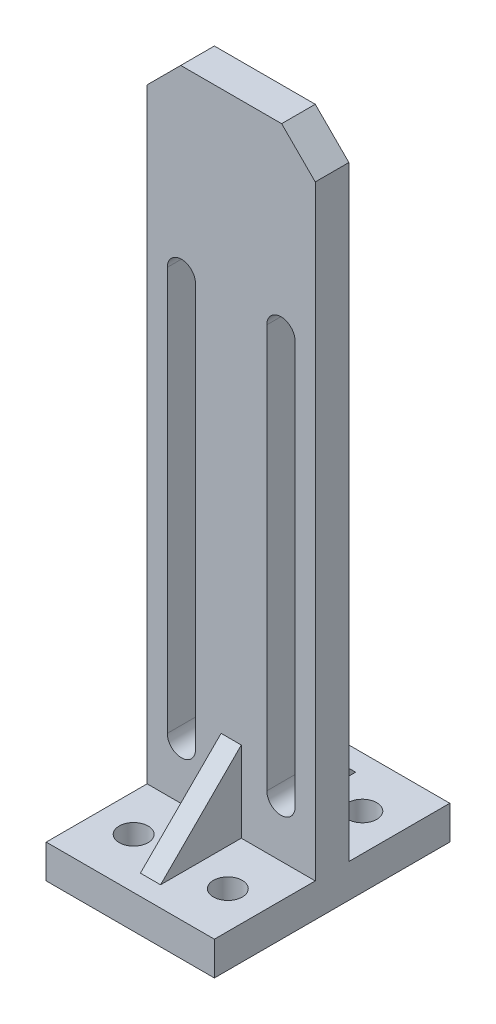
ISO-10303-21;
HEADER;
FILE_DESCRIPTION(('STEP AP214'),'2;1');
FILE_NAME('part.step','',(''),(''),'','','');
FILE_SCHEMA(('AUTOMOTIVE_DESIGN { 1 0 10303 214 1 1 1 1 }'));
ENDSEC;
DATA;
#1=APPLICATION_CONTEXT('core data for automotive mechanical design processes');
#2=APPLICATION_PROTOCOL_DEFINITION('international standard','automotive_design',2000,#1);
#3=PRODUCT_CONTEXT('',#1,'mechanical');
#4=PRODUCT('Part','Part','',(#3));
#5=PRODUCT_RELATED_PRODUCT_CATEGORY('part','',(#4));
#6=PRODUCT_DEFINITION_FORMATION('','',#4);
#7=PRODUCT_DEFINITION_CONTEXT('part definition',#1,'design');
#8=PRODUCT_DEFINITION('design','',#6,#7);
#9=PRODUCT_DEFINITION_SHAPE('','',#8);
#10=(LENGTH_UNIT() NAMED_UNIT(*) SI_UNIT(.MILLI.,.METRE.));
#11=(NAMED_UNIT(*) PLANE_ANGLE_UNIT() SI_UNIT($,.RADIAN.));
#12=(NAMED_UNIT(*) SI_UNIT($,.STERADIAN.) SOLID_ANGLE_UNIT());
#13=UNCERTAINTY_MEASURE_WITH_UNIT(LENGTH_MEASURE(1.E-05),#10,'distance_accuracy_value','');
#14=(GEOMETRIC_REPRESENTATION_CONTEXT(3) GLOBAL_UNCERTAINTY_ASSIGNED_CONTEXT((#13)) GLOBAL_UNIT_ASSIGNED_CONTEXT((#10,
#11,#12)) REPRESENTATION_CONTEXT('',''));
#15=CARTESIAN_POINT('',(0.,0.,0.));
#16=DIRECTION('',(0.,0.,1.));
#17=DIRECTION('',(1.,0.,0.));
#18=AXIS2_PLACEMENT_3D('',#15,#16,#17);
#19=CARTESIAN_POINT('',(0.,0.,2.5));
#20=DIRECTION('',(0.,0.,1.));
#21=DIRECTION('',(1.,0.,0.));
#22=AXIS2_PLACEMENT_3D('',#19,#20,#21);
#23=PLANE('',#22);
#24=DIRECTION('',(0.,1.,0.));
#25=VECTOR('',#24,1.);
#26=CARTESIAN_POINT('',(1.5,-33.,2.5));
#27=LINE('',#26,#25);
#28=CARTESIAN_POINT('',(1.5,-45.,2.5));
#29=VERTEX_POINT('',#28);
#30=CARTESIAN_POINT('',(1.5,-33.,2.5));
#31=VERTEX_POINT('',#30);
#32=EDGE_CURVE('E243',#29,#31,#27,.T.);
#33=ORIENTED_EDGE('',*,*,#32,.F.);
#34=DIRECTION('',(-1.,0.,0.));
#35=VECTOR('',#34,1.);
#36=CARTESIAN_POINT('',(12.5,-45.,2.5));
#37=LINE('',#36,#35);
#38=CARTESIAN_POINT('',(12.5,-45.,2.5));
#39=VERTEX_POINT('',#38);
#40=EDGE_CURVE('E308',#39,#29,#37,.T.);
#41=ORIENTED_EDGE('',*,*,#40,.F.);
#42=DIRECTION('',(0.,1.,0.));
#43=VECTOR('',#42,1.);
#44=CARTESIAN_POINT('',(12.5,45.,2.5));
#45=LINE('',#44,#43);
#46=CARTESIAN_POINT('',(12.5,45.,2.5));
#47=VERTEX_POINT('',#46);
#48=EDGE_CURVE('E399',#39,#47,#45,.T.);
#49=ORIENTED_EDGE('',*,*,#48,.T.);
#50=DIRECTION('',(-0.707106781186548,0.707106781186547,0.));
#51=VECTOR('',#50,1.);
#52=CARTESIAN_POINT('',(7.49999999999999,50.,2.5));
#53=LINE('',#52,#51);
#54=CARTESIAN_POINT('',(7.49999999999999,50.,2.5));
#55=VERTEX_POINT('',#54);
#56=EDGE_CURVE('E402',#47,#55,#53,.T.);
#57=ORIENTED_EDGE('',*,*,#56,.T.);
#58=DIRECTION('',(-1.,0.,0.));
#59=VECTOR('',#58,1.);
#60=CARTESIAN_POINT('',(-7.50000000000001,50.,2.5));
#61=LINE('',#60,#59);
#62=CARTESIAN_POINT('',(-7.50000000000001,50.,2.5));
#63=VERTEX_POINT('',#62);
#64=EDGE_CURVE('E406',#55,#63,#61,.T.);
#65=ORIENTED_EDGE('',*,*,#64,.T.);
#66=DIRECTION('',(-0.707106781186548,-0.707106781186547,0.));
#67=VECTOR('',#66,1.);
#68=CARTESIAN_POINT('',(-12.5,45.,2.5));
#69=LINE('',#68,#67);
#70=CARTESIAN_POINT('',(-12.5,45.,2.5));
#71=VERTEX_POINT('',#70);
#72=EDGE_CURVE('E409',#63,#71,#69,.T.);
#73=ORIENTED_EDGE('',*,*,#72,.T.);
#74=DIRECTION('',(0.,-1.,0.));
#75=VECTOR('',#74,1.);
#76=CARTESIAN_POINT('',(-12.5,45.,2.5));
#77=LINE('',#76,#75);
#78=CARTESIAN_POINT('',(-12.5,-45.,2.5));
#79=VERTEX_POINT('',#78);
#80=EDGE_CURVE('E412',#71,#79,#77,.T.);
#81=ORIENTED_EDGE('',*,*,#80,.T.);
#82=CARTESIAN_POINT('',(-1.5,-45.,2.5));
#83=VERTEX_POINT('',#82);
#84=EDGE_CURVE('E307',#83,#79,#37,.T.);
#85=ORIENTED_EDGE('',*,*,#84,.F.);
#86=DIRECTION('',(0.,1.,0.));
#87=VECTOR('',#86,1.);
#88=CARTESIAN_POINT('',(-1.5,-33.,2.5));
#89=LINE('',#88,#87);
#90=CARTESIAN_POINT('',(-1.5,-33.,2.5));
#91=VERTEX_POINT('',#90);
#92=EDGE_CURVE('E255',#83,#91,#89,.T.);
#93=ORIENTED_EDGE('',*,*,#92,.T.);
#94=DIRECTION('',(-1.,0.,0.));
#95=VECTOR('',#94,1.);
#96=CARTESIAN_POINT('',(1.5,-33.,2.5));
#97=LINE('',#96,#95);
#98=EDGE_CURVE('E263',#31,#91,#97,.T.);
#99=ORIENTED_EDGE('',*,*,#98,.F.);
#100=EDGE_LOOP('',(#33,#41,#49,#57,#65,#73,#81,#85,#93,#99));
#101=FACE_BOUND('',#100,.T.);
#102=DIRECTION('',(0.,-1.,0.));
#103=VECTOR('',#102,1.);
#104=CARTESIAN_POINT('',(5.3,23.,2.5));
#105=LINE('',#104,#103);
#106=CARTESIAN_POINT('',(5.3,23.,2.5));
#107=VERTEX_POINT('',#106);
#108=CARTESIAN_POINT('',(5.30000000000002,-37.,2.5));
#109=VERTEX_POINT('',#108);
#110=EDGE_CURVE('E359',#107,#109,#105,.T.);
#111=ORIENTED_EDGE('',*,*,#110,.F.);
#112=CARTESIAN_POINT('',(7.4,23.,2.5));
#113=DIRECTION('',(0.,0.,1.));
#114=DIRECTION('',(1.,0.,0.));
#115=AXIS2_PLACEMENT_3D('',#112,#113,#114);
#116=CIRCLE('',#115,2.1);
#117=CARTESIAN_POINT('',(9.5,23.,2.5));
#118=VERTEX_POINT('',#117);
#119=EDGE_CURVE('E356',#118,#107,#116,.T.);
#120=ORIENTED_EDGE('',*,*,#119,.F.);
#121=DIRECTION('',(0.,1.,0.));
#122=VECTOR('',#121,1.);
#123=CARTESIAN_POINT('',(9.5,23.,2.5));
#124=LINE('',#123,#122);
#125=CARTESIAN_POINT('',(9.49999999999998,-37.,2.5));
#126=VERTEX_POINT('',#125);
#127=EDGE_CURVE('E367',#126,#118,#124,.T.);
#128=ORIENTED_EDGE('',*,*,#127,.F.);
#129=CARTESIAN_POINT('',(7.40000000000001,-37.,2.5));
#130=DIRECTION('',(0.,0.,1.));
#131=DIRECTION('',(1.,0.,0.));
#132=AXIS2_PLACEMENT_3D('',#129,#130,#131);
#133=CIRCLE('',#132,2.09999999999998);
#134=EDGE_CURVE('E363',#109,#126,#133,.T.);
#135=ORIENTED_EDGE('',*,*,#134,.F.);
#136=EDGE_LOOP('',(#111,#120,#128,#135));
#137=FACE_BOUND('',#136,.T.);
#138=DIRECTION('',(0.,-1.,0.));
#139=VECTOR('',#138,1.);
#140=CARTESIAN_POINT('',(-9.49999999999999,23.,2.5));
#141=LINE('',#140,#139);
#142=CARTESIAN_POINT('',(-9.49999999999999,23.,2.5));
#143=VERTEX_POINT('',#142);
#144=CARTESIAN_POINT('',(-9.49999999999997,-37.,2.5));
#145=VERTEX_POINT('',#144);
#146=EDGE_CURVE('E316',#143,#145,#141,.T.);
#147=ORIENTED_EDGE('',*,*,#146,.F.);
#148=CARTESIAN_POINT('',(-7.39999999999999,23.,2.5));
#149=DIRECTION('',(0.,0.,1.));
#150=DIRECTION('',(-1.,0.,0.));
#151=AXIS2_PLACEMENT_3D('',#148,#149,#150);
#152=CIRCLE('',#151,2.1);
#153=CARTESIAN_POINT('',(-5.29999999999999,23.,2.5));
#154=VERTEX_POINT('',#153);
#155=EDGE_CURVE('E313',#154,#143,#152,.T.);
#156=ORIENTED_EDGE('',*,*,#155,.F.);
#157=DIRECTION('',(0.,1.,0.));
#158=VECTOR('',#157,1.);
#159=CARTESIAN_POINT('',(-5.29999999999999,23.,2.5));
#160=LINE('',#159,#158);
#161=CARTESIAN_POINT('',(-5.3,-37.,2.5));
#162=VERTEX_POINT('',#161);
#163=EDGE_CURVE('E324',#162,#154,#160,.T.);
#164=ORIENTED_EDGE('',*,*,#163,.F.);
#165=CARTESIAN_POINT('',(-7.4,-37.,2.5));
#166=DIRECTION('',(0.,0.,1.));
#167=DIRECTION('',(-1.,0.,0.));
#168=AXIS2_PLACEMENT_3D('',#165,#166,#167);
#169=CIRCLE('',#168,2.09999999999998);
#170=EDGE_CURVE('E320',#145,#162,#169,.T.);
#171=ORIENTED_EDGE('',*,*,#170,.F.);
#172=EDGE_LOOP('',(#147,#156,#164,#171));
#173=FACE_BOUND('',#172,.T.);
#174=ADVANCED_FACE('F39',(#101,#137,#173),#23,.T.);
#175=CARTESIAN_POINT('',(0.,0.,-2.5));
#176=DIRECTION('',(0.,0.,1.));
#177=DIRECTION('',(1.,0.,0.));
#178=AXIS2_PLACEMENT_3D('',#175,#176,#177);
#179=PLANE('',#178);
#180=CARTESIAN_POINT('',(7.4,23.,-2.5));
#181=DIRECTION('',(0.,0.,1.));
#182=DIRECTION('',(1.,0.,0.));
#183=AXIS2_PLACEMENT_3D('',#180,#181,#182);
#184=CIRCLE('',#183,2.1);
#185=CARTESIAN_POINT('',(9.5,23.,-2.5));
#186=VERTEX_POINT('',#185);
#187=CARTESIAN_POINT('',(5.3,23.,-2.5));
#188=VERTEX_POINT('',#187);
#189=EDGE_CURVE('E355',#186,#188,#184,.T.);
#190=ORIENTED_EDGE('',*,*,#189,.T.);
#191=DIRECTION('',(0.,-1.,0.));
#192=VECTOR('',#191,1.);
#193=CARTESIAN_POINT('',(5.3,23.,-2.5));
#194=LINE('',#193,#192);
#195=CARTESIAN_POINT('',(5.30000000000002,-37.,-2.5));
#196=VERTEX_POINT('',#195);
#197=EDGE_CURVE('E374',#188,#196,#194,.T.);
#198=ORIENTED_EDGE('',*,*,#197,.T.);
#199=CARTESIAN_POINT('',(7.40000000000001,-37.,-2.5));
#200=DIRECTION('',(0.,0.,1.));
#201=DIRECTION('',(1.,0.,0.));
#202=AXIS2_PLACEMENT_3D('',#199,#200,#201);
#203=CIRCLE('',#202,2.09999999999998);
#204=CARTESIAN_POINT('',(9.49999999999998,-37.,-2.5));
#205=VERTEX_POINT('',#204);
#206=EDGE_CURVE('E378',#196,#205,#203,.T.);
#207=ORIENTED_EDGE('',*,*,#206,.T.);
#208=DIRECTION('',(0.,1.,0.));
#209=VECTOR('',#208,1.);
#210=CARTESIAN_POINT('',(9.5,23.,-2.5));
#211=LINE('',#210,#209);
#212=EDGE_CURVE('E360',#205,#186,#211,.T.);
#213=ORIENTED_EDGE('',*,*,#212,.T.);
#214=EDGE_LOOP('',(#190,#198,#207,#213));
#215=FACE_BOUND('',#214,.T.);
#216=DIRECTION('',(-1.,0.,0.));
#217=VECTOR('',#216,1.);
#218=CARTESIAN_POINT('',(12.5,-45.,-2.5));
#219=LINE('',#218,#217);
#220=CARTESIAN_POINT('',(12.5,-45.,-2.5));
#221=VERTEX_POINT('',#220);
#222=CARTESIAN_POINT('',(1.5,-45.,-2.5));
#223=VERTEX_POINT('',#222);
#224=EDGE_CURVE('E212',#221,#223,#219,.T.);
#225=ORIENTED_EDGE('',*,*,#224,.T.);
#226=DIRECTION('',(0.,-1.,0.));
#227=VECTOR('',#226,1.);
#228=CARTESIAN_POINT('',(1.5,-33.,-2.5));
#229=LINE('',#228,#227);
#230=CARTESIAN_POINT('',(1.5,-33.,-2.5));
#231=VERTEX_POINT('',#230);
#232=EDGE_CURVE('E55',#231,#223,#229,.T.);
#233=ORIENTED_EDGE('',*,*,#232,.F.);
#234=DIRECTION('',(-1.,0.,0.));
#235=VECTOR('',#234,1.);
#236=CARTESIAN_POINT('',(1.5,-33.,-2.5));
#237=LINE('',#236,#235);
#238=CARTESIAN_POINT('',(-1.5,-33.,-2.5));
#239=VERTEX_POINT('',#238);
#240=EDGE_CURVE('E60',#231,#239,#237,.T.);
#241=ORIENTED_EDGE('',*,*,#240,.T.);
#242=DIRECTION('',(0.,-1.,0.));
#243=VECTOR('',#242,1.);
#244=CARTESIAN_POINT('',(-1.5,-33.,-2.5));
#245=LINE('',#244,#243);
#246=CARTESIAN_POINT('',(-1.5,-45.,-2.5));
#247=VERTEX_POINT('',#246);
#248=EDGE_CURVE('E215',#239,#247,#245,.T.);
#249=ORIENTED_EDGE('',*,*,#248,.T.);
#250=CARTESIAN_POINT('',(-12.5,-45.,-2.5));
#251=VERTEX_POINT('',#250);
#252=EDGE_CURVE('E201',#247,#251,#219,.T.);
#253=ORIENTED_EDGE('',*,*,#252,.T.);
#254=DIRECTION('',(0.,-1.,0.));
#255=VECTOR('',#254,1.);
#256=CARTESIAN_POINT('',(-12.5,45.,-2.5));
#257=LINE('',#256,#255);
#258=CARTESIAN_POINT('',(-12.5,45.,-2.5));
#259=VERTEX_POINT('',#258);
#260=EDGE_CURVE('E403',#259,#251,#257,.T.);
#261=ORIENTED_EDGE('',*,*,#260,.F.);
#262=DIRECTION('',(-0.707106781186548,-0.707106781186547,0.));
#263=VECTOR('',#262,1.);
#264=CARTESIAN_POINT('',(-12.5,45.,-2.5));
#265=LINE('',#264,#263);
#266=CARTESIAN_POINT('',(-7.50000000000001,50.,-2.5));
#267=VERTEX_POINT('',#266);
#268=EDGE_CURVE('E425',#267,#259,#265,.T.);
#269=ORIENTED_EDGE('',*,*,#268,.F.);
#270=DIRECTION('',(-1.,0.,0.));
#271=VECTOR('',#270,1.);
#272=CARTESIAN_POINT('',(-7.50000000000001,50.,-2.5));
#273=LINE('',#272,#271);
#274=CARTESIAN_POINT('',(7.49999999999999,50.,-2.5));
#275=VERTEX_POINT('',#274);
#276=EDGE_CURVE('E422',#275,#267,#273,.T.);
#277=ORIENTED_EDGE('',*,*,#276,.F.);
#278=DIRECTION('',(-0.707106781186548,0.707106781186547,0.));
#279=VECTOR('',#278,1.);
#280=CARTESIAN_POINT('',(7.49999999999999,50.,-2.5));
#281=LINE('',#280,#279);
#282=CARTESIAN_POINT('',(12.5,45.,-2.5));
#283=VERTEX_POINT('',#282);
#284=EDGE_CURVE('E419',#283,#275,#281,.T.);
#285=ORIENTED_EDGE('',*,*,#284,.F.);
#286=DIRECTION('',(0.,1.,0.));
#287=VECTOR('',#286,1.);
#288=CARTESIAN_POINT('',(12.5,45.,-2.5));
#289=LINE('',#288,#287);
#290=EDGE_CURVE('E398',#221,#283,#289,.T.);
#291=ORIENTED_EDGE('',*,*,#290,.F.);
#292=EDGE_LOOP('',(#225,#233,#241,#249,#253,#261,#269,#277,#285,#291));
#293=FACE_BOUND('',#292,.T.);
#294=CARTESIAN_POINT('',(-7.39999999999999,23.,-2.5));
#295=DIRECTION('',(0.,0.,1.));
#296=DIRECTION('',(-1.,0.,0.));
#297=AXIS2_PLACEMENT_3D('',#294,#295,#296);
#298=CIRCLE('',#297,2.1);
#299=CARTESIAN_POINT('',(-5.29999999999999,23.,-2.5));
#300=VERTEX_POINT('',#299);
#301=CARTESIAN_POINT('',(-9.49999999999999,23.,-2.5));
#302=VERTEX_POINT('',#301);
#303=EDGE_CURVE('E312',#300,#302,#298,.T.);
#304=ORIENTED_EDGE('',*,*,#303,.T.);
#305=DIRECTION('',(0.,-1.,0.));
#306=VECTOR('',#305,1.);
#307=CARTESIAN_POINT('',(-9.49999999999999,23.,-2.5));
#308=LINE('',#307,#306);
#309=CARTESIAN_POINT('',(-9.49999999999997,-37.,-2.5));
#310=VERTEX_POINT('',#309);
#311=EDGE_CURVE('E331',#302,#310,#308,.T.);
#312=ORIENTED_EDGE('',*,*,#311,.T.);
#313=CARTESIAN_POINT('',(-7.4,-37.,-2.5));
#314=DIRECTION('',(0.,0.,1.));
#315=DIRECTION('',(-1.,0.,0.));
#316=AXIS2_PLACEMENT_3D('',#313,#314,#315);
#317=CIRCLE('',#316,2.09999999999998);
#318=CARTESIAN_POINT('',(-5.30000000000002,-37.,-2.5));
#319=VERTEX_POINT('',#318);
#320=EDGE_CURVE('E335',#310,#319,#317,.T.);
#321=ORIENTED_EDGE('',*,*,#320,.T.);
#322=DIRECTION('',(0.,1.,0.));
#323=VECTOR('',#322,1.);
#324=CARTESIAN_POINT('',(-5.29999999999999,23.,-2.5));
#325=LINE('',#324,#323);
#326=EDGE_CURVE('E317',#319,#300,#325,.T.);
#327=ORIENTED_EDGE('',*,*,#326,.T.);
#328=EDGE_LOOP('',(#304,#312,#321,#327));
#329=FACE_BOUND('',#328,.T.);
#330=ADVANCED_FACE('F216',(#215,#293,#329),#179,.F.);
#331=CARTESIAN_POINT('',(12.5,45.,2.5));
#332=DIRECTION('',(-1.,0.,0.));
#333=DIRECTION('',(0.,-1.,0.));
#334=AXIS2_PLACEMENT_3D('',#331,#332,#333);
#335=PLANE('',#334);
#336=DIRECTION('',(0.,0.,-1.));
#337=VECTOR('',#336,1.);
#338=CARTESIAN_POINT('',(12.5,-50.,2.5));
#339=LINE('',#338,#337);
#340=CARTESIAN_POINT('',(12.5,-50.,17.5));
#341=VERTEX_POINT('',#340);
#342=CARTESIAN_POINT('',(12.5,-50.,-17.5));
#343=VERTEX_POINT('',#342);
#344=EDGE_CURVE('E416',#341,#343,#339,.T.);
#345=ORIENTED_EDGE('',*,*,#344,.T.);
#346=DIRECTION('',(0.,1.,0.));
#347=VECTOR('',#346,1.);
#348=CARTESIAN_POINT('',(12.5,-50.,-17.5));
#349=LINE('',#348,#347);
#350=CARTESIAN_POINT('',(12.5,-45.,-17.5));
#351=VERTEX_POINT('',#350);
#352=EDGE_CURVE('E268',#343,#351,#349,.T.);
#353=ORIENTED_EDGE('',*,*,#352,.T.);
#354=DIRECTION('',(0.,0.,1.));
#355=VECTOR('',#354,1.);
#356=CARTESIAN_POINT('',(12.5,-45.,-2.5));
#357=LINE('',#356,#355);
#358=EDGE_CURVE('E213',#351,#221,#357,.T.);
#359=ORIENTED_EDGE('',*,*,#358,.T.);
#360=ORIENTED_EDGE('',*,*,#290,.T.);
#361=DIRECTION('',(0.,0.,-1.));
#362=VECTOR('',#361,1.);
#363=CARTESIAN_POINT('',(12.5,45.,2.5));
#364=LINE('',#363,#362);
#365=EDGE_CURVE('E11',#47,#283,#364,.T.);
#366=ORIENTED_EDGE('',*,*,#365,.F.);
#367=ORIENTED_EDGE('',*,*,#48,.F.);
#368=DIRECTION('',(0.,0.,1.));
#369=VECTOR('',#368,1.);
#370=CARTESIAN_POINT('',(12.5,-45.,2.5));
#371=LINE('',#370,#369);
#372=CARTESIAN_POINT('',(12.5,-45.,17.5));
#373=VERTEX_POINT('',#372);
#374=EDGE_CURVE('E286',#39,#373,#371,.T.);
#375=ORIENTED_EDGE('',*,*,#374,.T.);
#376=DIRECTION('',(0.,-1.,0.));
#377=VECTOR('',#376,1.);
#378=CARTESIAN_POINT('',(12.5,-50.,17.5));
#379=LINE('',#378,#377);
#380=EDGE_CURVE('E289',#373,#341,#379,.T.);
#381=ORIENTED_EDGE('',*,*,#380,.T.);
#382=EDGE_LOOP('',(#345,#353,#359,#360,#366,#367,#375,#381));
#383=FACE_BOUND('',#382,.T.);
#384=ADVANCED_FACE('F41',(#383),#335,.F.);
#385=CARTESIAN_POINT('',(7.49999999999999,50.,2.5));
#386=DIRECTION('',(-0.707106781186547,-0.707106781186548,0.));
#387=DIRECTION('',(0.707106781186548,-0.707106781186547,0.));
#388=AXIS2_PLACEMENT_3D('',#385,#386,#387);
#389=PLANE('',#388);
#390=ORIENTED_EDGE('',*,*,#284,.T.);
#391=DIRECTION('',(0.,0.,-1.));
#392=VECTOR('',#391,1.);
#393=CARTESIAN_POINT('',(7.49999999999999,50.,2.5));
#394=LINE('',#393,#392);
#395=EDGE_CURVE('E48',#55,#275,#394,.T.);
#396=ORIENTED_EDGE('',*,*,#395,.F.);
#397=ORIENTED_EDGE('',*,*,#56,.F.);
#398=ORIENTED_EDGE('',*,*,#365,.T.);
#399=EDGE_LOOP('',(#390,#396,#397,#398));
#400=FACE_BOUND('',#399,.T.);
#401=ADVANCED_FACE('F470',(#400),#389,.F.);
#402=CARTESIAN_POINT('',(-7.50000000000001,50.,2.5));
#403=DIRECTION('',(0.,-1.,0.));
#404=DIRECTION('',(0.,0.,-1.));
#405=AXIS2_PLACEMENT_3D('',#402,#403,#404);
#406=PLANE('',#405);
#407=ORIENTED_EDGE('',*,*,#276,.T.);
#408=DIRECTION('',(0.,0.,-1.));
#409=VECTOR('',#408,1.);
#410=CARTESIAN_POINT('',(-7.50000000000001,50.,2.5));
#411=LINE('',#410,#409);
#412=EDGE_CURVE('E439',#63,#267,#411,.T.);
#413=ORIENTED_EDGE('',*,*,#412,.F.);
#414=ORIENTED_EDGE('',*,*,#64,.F.);
#415=ORIENTED_EDGE('',*,*,#395,.T.);
#416=EDGE_LOOP('',(#407,#413,#414,#415));
#417=FACE_BOUND('',#416,.T.);
#418=ADVANCED_FACE('F448',(#417),#406,.F.);
#419=CARTESIAN_POINT('',(-12.5,45.,2.5));
#420=DIRECTION('',(0.707106781186547,-0.707106781186548,0.));
#421=DIRECTION('',(0.707106781186548,0.707106781186547,0.));
#422=AXIS2_PLACEMENT_3D('',#419,#420,#421);
#423=PLANE('',#422);
#424=ORIENTED_EDGE('',*,*,#268,.T.);
#425=DIRECTION('',(0.,0.,-1.));
#426=VECTOR('',#425,1.);
#427=CARTESIAN_POINT('',(-12.5,45.,2.5));
#428=LINE('',#427,#426);
#429=EDGE_CURVE('E435',#71,#259,#428,.T.);
#430=ORIENTED_EDGE('',*,*,#429,.F.);
#431=ORIENTED_EDGE('',*,*,#72,.F.);
#432=ORIENTED_EDGE('',*,*,#412,.T.);
#433=EDGE_LOOP('',(#424,#430,#431,#432));
#434=FACE_BOUND('',#433,.T.);
#435=ADVANCED_FACE('F457',(#434),#423,.F.);
#436=CARTESIAN_POINT('',(-12.5,45.,2.5));
#437=DIRECTION('',(1.,0.,0.));
#438=DIRECTION('',(0.,1.,0.));
#439=AXIS2_PLACEMENT_3D('',#436,#437,#438);
#440=PLANE('',#439);
#441=ORIENTED_EDGE('',*,*,#260,.T.);
#442=DIRECTION('',(0.,0.,1.));
#443=VECTOR('',#442,1.);
#444=CARTESIAN_POINT('',(-12.5,-45.,-2.5));
#445=LINE('',#444,#443);
#446=CARTESIAN_POINT('',(-12.5,-45.,-17.5));
#447=VERTEX_POINT('',#446);
#448=EDGE_CURVE('E208',#447,#251,#445,.T.);
#449=ORIENTED_EDGE('',*,*,#448,.F.);
#450=DIRECTION('',(0.,1.,0.));
#451=VECTOR('',#450,1.);
#452=CARTESIAN_POINT('',(-12.5,-50.,-17.5));
#453=LINE('',#452,#451);
#454=CARTESIAN_POINT('',(-12.5,-50.,-17.5));
#455=VERTEX_POINT('',#454);
#456=EDGE_CURVE('E267',#455,#447,#453,.T.);
#457=ORIENTED_EDGE('',*,*,#456,.F.);
#458=DIRECTION('',(0.,0.,-1.));
#459=VECTOR('',#458,1.);
#460=CARTESIAN_POINT('',(-12.5,-50.,2.5));
#461=LINE('',#460,#459);
#462=CARTESIAN_POINT('',(-12.5,-50.,17.5));
#463=VERTEX_POINT('',#462);
#464=EDGE_CURVE('E432',#463,#455,#461,.T.);
#465=ORIENTED_EDGE('',*,*,#464,.F.);
#466=DIRECTION('',(0.,-1.,0.));
#467=VECTOR('',#466,1.);
#468=CARTESIAN_POINT('',(-12.5,-50.,17.5));
#469=LINE('',#468,#467);
#470=CARTESIAN_POINT('',(-12.5,-45.,17.5));
#471=VERTEX_POINT('',#470);
#472=EDGE_CURVE('E290',#471,#463,#469,.T.);
#473=ORIENTED_EDGE('',*,*,#472,.F.);
#474=DIRECTION('',(0.,0.,1.));
#475=VECTOR('',#474,1.);
#476=CARTESIAN_POINT('',(-12.5,-45.,2.5));
#477=LINE('',#476,#475);
#478=EDGE_CURVE('E285',#79,#471,#477,.T.);
#479=ORIENTED_EDGE('',*,*,#478,.F.);
#480=ORIENTED_EDGE('',*,*,#80,.F.);
#481=ORIENTED_EDGE('',*,*,#429,.T.);
#482=EDGE_LOOP('',(#441,#449,#457,#465,#473,#479,#480,#481));
#483=FACE_BOUND('',#482,.T.);
#484=ADVANCED_FACE('F461',(#483),#440,.F.);
#485=CARTESIAN_POINT('',(-12.5,-50.,2.5));
#486=DIRECTION('',(0.,1.,0.));
#487=DIRECTION('',(0.,0.,1.));
#488=AXIS2_PLACEMENT_3D('',#485,#486,#487);
#489=PLANE('',#488);
#490=CARTESIAN_POINT('',(-7.,-50.,10.));
#491=DIRECTION('',(0.,1.,0.));
#492=DIRECTION('',(0.,0.,1.));
#493=AXIS2_PLACEMENT_3D('',#490,#491,#492);
#494=CIRCLE('',#493,2.15);
#495=CARTESIAN_POINT('',(-7.,-50.,12.15));
#496=VERTEX_POINT('',#495);
#497=EDGE_CURVE('E497',#496,#496,#494,.F.);
#498=ORIENTED_EDGE('',*,*,#497,.F.);
#499=EDGE_LOOP('',(#498));
#500=FACE_BOUND('',#499,.T.);
#501=CARTESIAN_POINT('',(7.,-50.,10.));
#502=DIRECTION('',(0.,1.,0.));
#503=DIRECTION('',(0.,0.,1.));
#504=AXIS2_PLACEMENT_3D('',#501,#502,#503);
#505=CIRCLE('',#504,2.15);
#506=CARTESIAN_POINT('',(7.,-50.,12.15));
#507=VERTEX_POINT('',#506);
#508=EDGE_CURVE('E506',#507,#507,#505,.F.);
#509=ORIENTED_EDGE('',*,*,#508,.F.);
#510=EDGE_LOOP('',(#509));
#511=FACE_BOUND('',#510,.T.);
#512=CARTESIAN_POINT('',(7.,-50.,-10.));
#513=DIRECTION('',(0.,1.,0.));
#514=DIRECTION('',(0.,0.,1.));
#515=AXIS2_PLACEMENT_3D('',#512,#513,#514);
#516=CIRCLE('',#515,2.15);
#517=CARTESIAN_POINT('',(7.,-50.,-7.85));
#518=VERTEX_POINT('',#517);
#519=EDGE_CURVE('E494',#518,#518,#516,.F.);
#520=ORIENTED_EDGE('',*,*,#519,.F.);
#521=EDGE_LOOP('',(#520));
#522=FACE_BOUND('',#521,.T.);
#523=CARTESIAN_POINT('',(-7.,-50.,-10.));
#524=DIRECTION('',(0.,1.,0.));
#525=DIRECTION('',(0.,0.,1.));
#526=AXIS2_PLACEMENT_3D('',#523,#524,#525);
#527=CIRCLE('',#526,2.15);
#528=CARTESIAN_POINT('',(-7.,-50.,-7.85));
#529=VERTEX_POINT('',#528);
#530=EDGE_CURVE('E485',#529,#529,#527,.F.);
#531=ORIENTED_EDGE('',*,*,#530,.F.);
#532=EDGE_LOOP('',(#531));
#533=FACE_BOUND('',#532,.T.);
#534=ORIENTED_EDGE('',*,*,#464,.T.);
#535=DIRECTION('',(-1.,0.,0.));
#536=VECTOR('',#535,1.);
#537=CARTESIAN_POINT('',(12.5,-50.,-17.5));
#538=LINE('',#537,#536);
#539=EDGE_CURVE('E281',#343,#455,#538,.T.);
#540=ORIENTED_EDGE('',*,*,#539,.F.);
#541=ORIENTED_EDGE('',*,*,#344,.F.);
#542=DIRECTION('',(-1.,0.,0.));
#543=VECTOR('',#542,1.);
#544=CARTESIAN_POINT('',(12.5,-50.,17.5));
#545=LINE('',#544,#543);
#546=EDGE_CURVE('E294',#341,#463,#545,.T.);
#547=ORIENTED_EDGE('',*,*,#546,.T.);
#548=EDGE_LOOP('',(#534,#540,#541,#547));
#549=FACE_BOUND('',#548,.T.);
#550=ADVANCED_FACE('F554',(#500,#511,#522,#533,#549),#489,.F.);
#551=CARTESIAN_POINT('',(7.4,23.,2.5));
#552=DIRECTION('',(0.,0.,-1.));
#553=DIRECTION('',(-1.,0.,0.));
#554=AXIS2_PLACEMENT_3D('',#551,#552,#553);
#555=CYLINDRICAL_SURFACE('',#554,2.1);
#556=ORIENTED_EDGE('',*,*,#189,.F.);
#557=DIRECTION('',(0.,0.,-1.));
#558=VECTOR('',#557,1.);
#559=CARTESIAN_POINT('',(9.5,23.,2.5));
#560=LINE('',#559,#558);
#561=EDGE_CURVE('E370',#118,#186,#560,.T.);
#562=ORIENTED_EDGE('',*,*,#561,.F.);
#563=ORIENTED_EDGE('',*,*,#119,.T.);
#564=DIRECTION('',(0.,0.,-1.));
#565=VECTOR('',#564,1.);
#566=CARTESIAN_POINT('',(5.3,23.,2.5));
#567=LINE('',#566,#565);
#568=EDGE_CURVE('E394',#107,#188,#567,.T.);
#569=ORIENTED_EDGE('',*,*,#568,.T.);
#570=EDGE_LOOP('',(#556,#562,#563,#569));
#571=FACE_BOUND('',#570,.T.);
#572=ADVANCED_FACE('F551',(#571),#555,.F.);
#573=CARTESIAN_POINT('',(5.3,23.,2.5));
#574=DIRECTION('',(1.,0.,0.));
#575=DIRECTION('',(0.,1.,0.));
#576=AXIS2_PLACEMENT_3D('',#573,#574,#575);
#577=PLANE('',#576);
#578=ORIENTED_EDGE('',*,*,#197,.F.);
#579=ORIENTED_EDGE('',*,*,#568,.F.);
#580=ORIENTED_EDGE('',*,*,#110,.T.);
#581=DIRECTION('',(0.,0.,-1.));
#582=VECTOR('',#581,1.);
#583=CARTESIAN_POINT('',(5.30000000000002,-37.,2.5));
#584=LINE('',#583,#582);
#585=EDGE_CURVE('E391',#109,#196,#584,.T.);
#586=ORIENTED_EDGE('',*,*,#585,.T.);
#587=EDGE_LOOP('',(#578,#579,#580,#586));
#588=FACE_BOUND('',#587,.T.);
#589=ADVANCED_FACE('F738',(#588),#577,.T.);
#590=CARTESIAN_POINT('',(7.40000000000001,-37.,2.5));
#591=DIRECTION('',(0.,0.,-1.));
#592=DIRECTION('',(-1.,0.,0.));
#593=AXIS2_PLACEMENT_3D('',#590,#591,#592);
#594=CYLINDRICAL_SURFACE('',#593,2.09999999999998);
#595=ORIENTED_EDGE('',*,*,#206,.F.);
#596=ORIENTED_EDGE('',*,*,#585,.F.);
#597=ORIENTED_EDGE('',*,*,#134,.T.);
#598=DIRECTION('',(0.,0.,-1.));
#599=VECTOR('',#598,1.);
#600=CARTESIAN_POINT('',(9.49999999999998,-37.,2.5));
#601=LINE('',#600,#599);
#602=EDGE_CURVE('E388',#126,#205,#601,.T.);
#603=ORIENTED_EDGE('',*,*,#602,.T.);
#604=EDGE_LOOP('',(#595,#596,#597,#603));
#605=FACE_BOUND('',#604,.T.);
#606=ADVANCED_FACE('F735',(#605),#594,.F.);
#607=CARTESIAN_POINT('',(9.5,23.,2.5));
#608=DIRECTION('',(-1.,0.,0.));
#609=DIRECTION('',(0.,-1.,0.));
#610=AXIS2_PLACEMENT_3D('',#607,#608,#609);
#611=PLANE('',#610);
#612=ORIENTED_EDGE('',*,*,#212,.F.);
#613=ORIENTED_EDGE('',*,*,#602,.F.);
#614=ORIENTED_EDGE('',*,*,#127,.T.);
#615=ORIENTED_EDGE('',*,*,#561,.T.);
#616=EDGE_LOOP('',(#612,#613,#614,#615));
#617=FACE_BOUND('',#616,.T.);
#618=ADVANCED_FACE('F731',(#617),#611,.T.);
#619=CARTESIAN_POINT('',(-7.39999999999999,23.,2.5));
#620=DIRECTION('',(0.,0.,-1.));
#621=DIRECTION('',(-1.,0.,0.));
#622=AXIS2_PLACEMENT_3D('',#619,#620,#621);
#623=CYLINDRICAL_SURFACE('',#622,2.1);
#624=ORIENTED_EDGE('',*,*,#303,.F.);
#625=DIRECTION('',(0.,0.,-1.));
#626=VECTOR('',#625,1.);
#627=CARTESIAN_POINT('',(-5.29999999999999,23.,2.5));
#628=LINE('',#627,#626);
#629=EDGE_CURVE('E327',#154,#300,#628,.T.);
#630=ORIENTED_EDGE('',*,*,#629,.F.);
#631=ORIENTED_EDGE('',*,*,#155,.T.);
#632=DIRECTION('',(0.,0.,-1.));
#633=VECTOR('',#632,1.);
#634=CARTESIAN_POINT('',(-9.49999999999999,23.,2.5));
#635=LINE('',#634,#633);
#636=EDGE_CURVE('E351',#143,#302,#635,.T.);
#637=ORIENTED_EDGE('',*,*,#636,.T.);
#638=EDGE_LOOP('',(#624,#630,#631,#637));
#639=FACE_BOUND('',#638,.T.);
#640=ADVANCED_FACE('F727',(#639),#623,.F.);
#641=CARTESIAN_POINT('',(-9.49999999999999,23.,2.5));
#642=DIRECTION('',(1.,0.,0.));
#643=DIRECTION('',(0.,1.,0.));
#644=AXIS2_PLACEMENT_3D('',#641,#642,#643);
#645=PLANE('',#644);
#646=ORIENTED_EDGE('',*,*,#311,.F.);
#647=ORIENTED_EDGE('',*,*,#636,.F.);
#648=ORIENTED_EDGE('',*,*,#146,.T.);
#649=DIRECTION('',(0.,0.,-1.));
#650=VECTOR('',#649,1.);
#651=CARTESIAN_POINT('',(-9.49999999999997,-37.,2.5));
#652=LINE('',#651,#650);
#653=EDGE_CURVE('E348',#145,#310,#652,.T.);
#654=ORIENTED_EDGE('',*,*,#653,.T.);
#655=EDGE_LOOP('',(#646,#647,#648,#654));
#656=FACE_BOUND('',#655,.T.);
#657=ADVANCED_FACE('F723',(#656),#645,.T.);
#658=CARTESIAN_POINT('',(-7.4,-37.,2.5));
#659=DIRECTION('',(0.,0.,-1.));
#660=DIRECTION('',(-1.,0.,0.));
#661=AXIS2_PLACEMENT_3D('',#658,#659,#660);
#662=CYLINDRICAL_SURFACE('',#661,2.09999999999998);
#663=ORIENTED_EDGE('',*,*,#320,.F.);
#664=ORIENTED_EDGE('',*,*,#653,.F.);
#665=ORIENTED_EDGE('',*,*,#170,.T.);
#666=DIRECTION('',(0.,0.,-1.));
#667=VECTOR('',#666,1.);
#668=CARTESIAN_POINT('',(-5.30000000000002,-37.,2.5));
#669=LINE('',#668,#667);
#670=EDGE_CURVE('E345',#162,#319,#669,.T.);
#671=ORIENTED_EDGE('',*,*,#670,.T.);
#672=EDGE_LOOP('',(#663,#664,#665,#671));
#673=FACE_BOUND('',#672,.T.);
#674=ADVANCED_FACE('F719',(#673),#662,.F.);
#675=CARTESIAN_POINT('',(-5.29999999999999,23.,2.5));
#676=DIRECTION('',(-1.,0.,0.));
#677=DIRECTION('',(0.,-1.,0.));
#678=AXIS2_PLACEMENT_3D('',#675,#676,#677);
#679=PLANE('',#678);
#680=ORIENTED_EDGE('',*,*,#326,.F.);
#681=ORIENTED_EDGE('',*,*,#670,.F.);
#682=ORIENTED_EDGE('',*,*,#163,.T.);
#683=ORIENTED_EDGE('',*,*,#629,.T.);
#684=EDGE_LOOP('',(#680,#681,#682,#683));
#685=FACE_BOUND('',#684,.T.);
#686=ADVANCED_FACE('F651',(#685),#679,.T.);
#687=CARTESIAN_POINT('',(12.5,-45.,2.5));
#688=DIRECTION('',(0.,-1.,0.));
#689=DIRECTION('',(0.,0.,-1.));
#690=AXIS2_PLACEMENT_3D('',#687,#688,#689);
#691=PLANE('',#690);
#692=CARTESIAN_POINT('',(-7.,-45.,10.));
#693=DIRECTION('',(0.,1.,0.));
#694=DIRECTION('',(0.,0.,-1.));
#695=AXIS2_PLACEMENT_3D('',#692,#693,#694);
#696=CIRCLE('',#695,2.15);
#697=CARTESIAN_POINT('',(-7.,-45.,7.85));
#698=VERTEX_POINT('',#697);
#699=EDGE_CURVE('E502',#698,#698,#696,.T.);
#700=ORIENTED_EDGE('',*,*,#699,.F.);
#701=EDGE_LOOP('',(#700));
#702=FACE_BOUND('',#701,.T.);
#703=CARTESIAN_POINT('',(7.,-45.,10.));
#704=DIRECTION('',(0.,1.,0.));
#705=DIRECTION('',(0.,0.,1.));
#706=AXIS2_PLACEMENT_3D('',#703,#704,#705);
#707=CIRCLE('',#706,2.15);
#708=CARTESIAN_POINT('',(7.,-45.,12.15));
#709=VERTEX_POINT('',#708);
#710=EDGE_CURVE('E501',#709,#709,#707,.T.);
#711=ORIENTED_EDGE('',*,*,#710,.F.);
#712=EDGE_LOOP('',(#711));
#713=FACE_BOUND('',#712,.T.);
#714=ORIENTED_EDGE('',*,*,#40,.T.);
#715=DIRECTION('',(0.,0.,-1.));
#716=VECTOR('',#715,1.);
#717=CARTESIAN_POINT('',(1.5,-45.,2.5));
#718=LINE('',#717,#716);
#719=CARTESIAN_POINT('',(1.5,-45.,14.5));
#720=VERTEX_POINT('',#719);
#721=EDGE_CURVE('E239',#720,#29,#718,.T.);
#722=ORIENTED_EDGE('',*,*,#721,.F.);
#723=DIRECTION('',(-1.,0.,0.));
#724=VECTOR('',#723,1.);
#725=CARTESIAN_POINT('',(1.5,-45.,14.5));
#726=LINE('',#725,#724);
#727=CARTESIAN_POINT('',(-1.5,-45.,14.5));
#728=VERTEX_POINT('',#727);
#729=EDGE_CURVE('E252',#720,#728,#726,.T.);
#730=ORIENTED_EDGE('',*,*,#729,.T.);
#731=DIRECTION('',(0.,0.,-1.));
#732=VECTOR('',#731,1.);
#733=CARTESIAN_POINT('',(-1.5,-45.,2.5));
#734=LINE('',#733,#732);
#735=EDGE_CURVE('E238',#728,#83,#734,.T.);
#736=ORIENTED_EDGE('',*,*,#735,.T.);
#737=ORIENTED_EDGE('',*,*,#84,.T.);
#738=ORIENTED_EDGE('',*,*,#478,.T.);
#739=DIRECTION('',(-1.,0.,0.));
#740=VECTOR('',#739,1.);
#741=CARTESIAN_POINT('',(12.5,-45.,17.5));
#742=LINE('',#741,#740);
#743=EDGE_CURVE('E303',#373,#471,#742,.T.);
#744=ORIENTED_EDGE('',*,*,#743,.F.);
#745=ORIENTED_EDGE('',*,*,#374,.F.);
#746=EDGE_LOOP('',(#714,#722,#730,#736,#737,#738,#744,#745));
#747=FACE_BOUND('',#746,.T.);
#748=ADVANCED_FACE('F646',(#702,#713,#747),#691,.F.);
#749=CARTESIAN_POINT('',(12.5,-50.,17.5));
#750=DIRECTION('',(0.,0.,-1.));
#751=DIRECTION('',(-1.,0.,0.));
#752=AXIS2_PLACEMENT_3D('',#749,#750,#751);
#753=PLANE('',#752);
#754=ORIENTED_EDGE('',*,*,#472,.T.);
#755=ORIENTED_EDGE('',*,*,#546,.F.);
#756=ORIENTED_EDGE('',*,*,#380,.F.);
#757=ORIENTED_EDGE('',*,*,#743,.T.);
#758=EDGE_LOOP('',(#754,#755,#756,#757));
#759=FACE_BOUND('',#758,.T.);
#760=ADVANCED_FACE('F650',(#759),#753,.F.);
#761=CARTESIAN_POINT('',(12.5,-50.,-17.5));
#762=DIRECTION('',(0.,0.,1.));
#763=DIRECTION('',(1.,0.,0.));
#764=AXIS2_PLACEMENT_3D('',#761,#762,#763);
#765=PLANE('',#764);
#766=ORIENTED_EDGE('',*,*,#456,.T.);
#767=DIRECTION('',(-1.,0.,0.));
#768=VECTOR('',#767,1.);
#769=CARTESIAN_POINT('',(12.5,-45.,-17.5));
#770=LINE('',#769,#768);
#771=EDGE_CURVE('E278',#351,#447,#770,.T.);
#772=ORIENTED_EDGE('',*,*,#771,.F.);
#773=ORIENTED_EDGE('',*,*,#352,.F.);
#774=ORIENTED_EDGE('',*,*,#539,.T.);
#775=EDGE_LOOP('',(#766,#772,#773,#774));
#776=FACE_BOUND('',#775,.T.);
#777=ADVANCED_FACE('F526',(#776),#765,.F.);
#778=CARTESIAN_POINT('',(12.5,-45.,-2.5));
#779=DIRECTION('',(0.,-1.,0.));
#780=DIRECTION('',(0.,0.,-1.));
#781=AXIS2_PLACEMENT_3D('',#778,#779,#780);
#782=PLANE('',#781);
#783=CARTESIAN_POINT('',(7.,-45.,-10.));
#784=DIRECTION('',(0.,1.,0.));
#785=DIRECTION('',(0.,0.,-1.));
#786=AXIS2_PLACEMENT_3D('',#783,#784,#785);
#787=CIRCLE('',#786,2.15);
#788=CARTESIAN_POINT('',(7.,-45.,-12.15));
#789=VERTEX_POINT('',#788);
#790=EDGE_CURVE('E510',#789,#789,#787,.T.);
#791=ORIENTED_EDGE('',*,*,#790,.F.);
#792=EDGE_LOOP('',(#791));
#793=FACE_BOUND('',#792,.T.);
#794=CARTESIAN_POINT('',(-7.,-45.,-10.));
#795=DIRECTION('',(0.,1.,0.));
#796=DIRECTION('',(0.,0.,1.));
#797=AXIS2_PLACEMENT_3D('',#794,#795,#796);
#798=CIRCLE('',#797,2.15);
#799=CARTESIAN_POINT('',(-7.,-45.,-7.85));
#800=VERTEX_POINT('',#799);
#801=EDGE_CURVE('E489',#800,#800,#798,.T.);
#802=ORIENTED_EDGE('',*,*,#801,.F.);
#803=EDGE_LOOP('',(#802));
#804=FACE_BOUND('',#803,.T.);
#805=DIRECTION('',(-1.,0.,0.));
#806=VECTOR('',#805,1.);
#807=CARTESIAN_POINT('',(1.5,-45.,-14.5));
#808=LINE('',#807,#806);
#809=CARTESIAN_POINT('',(1.5,-45.,-14.5));
#810=VERTEX_POINT('',#809);
#811=CARTESIAN_POINT('',(-1.5,-45.,-14.5));
#812=VERTEX_POINT('',#811);
#813=EDGE_CURVE('E232',#810,#812,#808,.T.);
#814=ORIENTED_EDGE('',*,*,#813,.F.);
#815=DIRECTION('',(0.,0.,-1.));
#816=VECTOR('',#815,1.);
#817=CARTESIAN_POINT('',(1.5,-45.,-2.5));
#818=LINE('',#817,#816);
#819=EDGE_CURVE('E235',#223,#810,#818,.T.);
#820=ORIENTED_EDGE('',*,*,#819,.F.);
#821=ORIENTED_EDGE('',*,*,#224,.F.);
#822=ORIENTED_EDGE('',*,*,#358,.F.);
#823=ORIENTED_EDGE('',*,*,#771,.T.);
#824=ORIENTED_EDGE('',*,*,#448,.T.);
#825=ORIENTED_EDGE('',*,*,#252,.F.);
#826=DIRECTION('',(0.,0.,-1.));
#827=VECTOR('',#826,1.);
#828=CARTESIAN_POINT('',(-1.5,-45.,-2.5));
#829=LINE('',#828,#827);
#830=EDGE_CURVE('E204',#247,#812,#829,.T.);
#831=ORIENTED_EDGE('',*,*,#830,.T.);
#832=EDGE_LOOP('',(#814,#820,#821,#822,#823,#824,#825,#831));
#833=FACE_BOUND('',#832,.T.);
#834=ADVANCED_FACE('F202',(#793,#804,#833),#782,.F.);
#835=CARTESIAN_POINT('',(1.5,-45.,14.5));
#836=DIRECTION('',(0.,-0.707106781186548,-0.707106781186547));
#837=DIRECTION('',(0.,0.707106781186547,-0.707106781186548));
#838=AXIS2_PLACEMENT_3D('',#835,#836,#837);
#839=PLANE('',#838);
#840=DIRECTION('',(0.,-0.707106781186547,0.707106781186548));
#841=VECTOR('',#840,1.);
#842=CARTESIAN_POINT('',(-1.5,-45.,14.5));
#843=LINE('',#842,#841);
#844=EDGE_CURVE('E244',#91,#728,#843,.T.);
#845=ORIENTED_EDGE('',*,*,#844,.T.);
#846=ORIENTED_EDGE('',*,*,#729,.F.);
#847=DIRECTION('',(0.,-0.707106781186547,0.707106781186548));
#848=VECTOR('',#847,1.);
#849=CARTESIAN_POINT('',(1.5,-45.,14.5));
#850=LINE('',#849,#848);
#851=EDGE_CURVE('E248',#31,#720,#850,.T.);
#852=ORIENTED_EDGE('',*,*,#851,.F.);
#853=ORIENTED_EDGE('',*,*,#98,.T.);
#854=EDGE_LOOP('',(#845,#846,#852,#853));
#855=FACE_BOUND('',#854,.T.);
#856=ADVANCED_FACE('F525',(#855),#839,.F.);
#857=CARTESIAN_POINT('',(1.5,0.,0.));
#858=DIRECTION('',(1.,0.,0.));
#859=DIRECTION('',(0.,0.,-1.));
#860=AXIS2_PLACEMENT_3D('',#857,#858,#859);
#861=PLANE('',#860);
#862=ORIENTED_EDGE('',*,*,#721,.T.);
#863=ORIENTED_EDGE('',*,*,#32,.T.);
#864=ORIENTED_EDGE('',*,*,#851,.T.);
#865=EDGE_LOOP('',(#862,#863,#864));
#866=FACE_BOUND('',#865,.T.);
#867=ADVANCED_FACE('F588',(#866),#861,.T.);
#868=CARTESIAN_POINT('',(-1.5,0.,0.));
#869=DIRECTION('',(1.,0.,0.));
#870=DIRECTION('',(0.,0.,-1.));
#871=AXIS2_PLACEMENT_3D('',#868,#869,#870);
#872=PLANE('',#871);
#873=ORIENTED_EDGE('',*,*,#735,.F.);
#874=ORIENTED_EDGE('',*,*,#844,.F.);
#875=ORIENTED_EDGE('',*,*,#92,.F.);
#876=EDGE_LOOP('',(#873,#874,#875));
#877=FACE_BOUND('',#876,.T.);
#878=ADVANCED_FACE('F599',(#877),#872,.F.);
#879=CARTESIAN_POINT('',(1.5,-45.,-14.5));
#880=DIRECTION('',(0.,-0.707106781186548,0.707106781186547));
#881=DIRECTION('',(0.,-0.707106781186547,-0.707106781186548));
#882=AXIS2_PLACEMENT_3D('',#879,#880,#881);
#883=PLANE('',#882);
#884=DIRECTION('',(0.,0.707106781186547,0.707106781186548));
#885=VECTOR('',#884,1.);
#886=CARTESIAN_POINT('',(-1.5,-45.,-14.5));
#887=LINE('',#886,#885);
#888=EDGE_CURVE('E222',#812,#239,#887,.T.);
#889=ORIENTED_EDGE('',*,*,#888,.T.);
#890=ORIENTED_EDGE('',*,*,#240,.F.);
#891=DIRECTION('',(0.,0.707106781186547,0.707106781186548));
#892=VECTOR('',#891,1.);
#893=CARTESIAN_POINT('',(1.5,-45.,-14.5));
#894=LINE('',#893,#892);
#895=EDGE_CURVE('E226',#810,#231,#894,.T.);
#896=ORIENTED_EDGE('',*,*,#895,.F.);
#897=ORIENTED_EDGE('',*,*,#813,.T.);
#898=EDGE_LOOP('',(#889,#890,#896,#897));
#899=FACE_BOUND('',#898,.T.);
#900=ADVANCED_FACE('F609',(#899),#883,.F.);
#901=CARTESIAN_POINT('',(1.5,0.,0.));
#902=DIRECTION('',(1.,0.,0.));
#903=DIRECTION('',(0.,0.,-1.));
#904=AXIS2_PLACEMENT_3D('',#901,#902,#903);
#905=PLANE('',#904);
#906=ORIENTED_EDGE('',*,*,#895,.T.);
#907=ORIENTED_EDGE('',*,*,#232,.T.);
#908=ORIENTED_EDGE('',*,*,#819,.T.);
#909=EDGE_LOOP('',(#906,#907,#908));
#910=FACE_BOUND('',#909,.T.);
#911=ADVANCED_FACE('F477',(#910),#905,.T.);
#912=CARTESIAN_POINT('',(-1.5,0.,0.));
#913=DIRECTION('',(1.,0.,0.));
#914=DIRECTION('',(0.,0.,-1.));
#915=AXIS2_PLACEMENT_3D('',#912,#913,#914);
#916=PLANE('',#915);
#917=ORIENTED_EDGE('',*,*,#888,.F.);
#918=ORIENTED_EDGE('',*,*,#830,.F.);
#919=ORIENTED_EDGE('',*,*,#248,.F.);
#920=EDGE_LOOP('',(#917,#918,#919));
#921=FACE_BOUND('',#920,.T.);
#922=ADVANCED_FACE('F224',(#921),#916,.F.);
#923=CARTESIAN_POINT('',(-7.,-56.0811183182043,-10.));
#924=DIRECTION('',(0.,1.,0.));
#925=DIRECTION('',(0.,0.,1.));
#926=AXIS2_PLACEMENT_3D('',#923,#924,#925);
#927=CYLINDRICAL_SURFACE('',#926,2.15);
#928=ORIENTED_EDGE('',*,*,#530,.T.);
#929=EDGE_LOOP('',(#928));
#930=FACE_BOUND('',#929,.T.);
#931=ORIENTED_EDGE('',*,*,#801,.T.);
#932=EDGE_LOOP('',(#931));
#933=FACE_BOUND('',#932,.T.);
#934=ADVANCED_FACE('F530',(#930,#933),#927,.F.);
#935=CARTESIAN_POINT('',(7.,-56.0811183182043,-10.));
#936=DIRECTION('',(0.,1.,0.));
#937=DIRECTION('',(0.,0.,1.));
#938=AXIS2_PLACEMENT_3D('',#935,#936,#937);
#939=CYLINDRICAL_SURFACE('',#938,2.15);
#940=ORIENTED_EDGE('',*,*,#519,.T.);
#941=EDGE_LOOP('',(#940));
#942=FACE_BOUND('',#941,.T.);
#943=ORIENTED_EDGE('',*,*,#790,.T.);
#944=EDGE_LOOP('',(#943));
#945=FACE_BOUND('',#944,.T.);
#946=ADVANCED_FACE('F521',(#942,#945),#939,.F.);
#947=CARTESIAN_POINT('',(7.,-56.0811183182043,10.));
#948=DIRECTION('',(0.,1.,0.));
#949=DIRECTION('',(0.,0.,1.));
#950=AXIS2_PLACEMENT_3D('',#947,#948,#949);
#951=CYLINDRICAL_SURFACE('',#950,2.15);
#952=ORIENTED_EDGE('',*,*,#508,.T.);
#953=EDGE_LOOP('',(#952));
#954=FACE_BOUND('',#953,.T.);
#955=ORIENTED_EDGE('',*,*,#710,.T.);
#956=EDGE_LOOP('',(#955));
#957=FACE_BOUND('',#956,.T.);
#958=ADVANCED_FACE('F537',(#954,#957),#951,.F.);
#959=CARTESIAN_POINT('',(-7.,-56.0811183182043,10.));
#960=DIRECTION('',(0.,1.,0.));
#961=DIRECTION('',(0.,0.,1.));
#962=AXIS2_PLACEMENT_3D('',#959,#960,#961);
#963=CYLINDRICAL_SURFACE('',#962,2.15);
#964=ORIENTED_EDGE('',*,*,#497,.T.);
#965=EDGE_LOOP('',(#964));
#966=FACE_BOUND('',#965,.T.);
#967=ORIENTED_EDGE('',*,*,#699,.T.);
#968=EDGE_LOOP('',(#967));
#969=FACE_BOUND('',#968,.T.);
#970=ADVANCED_FACE('F680',(#966,#969),#963,.F.);
#971=CLOSED_SHELL('',(#174,#330,#384,#401,#418,#435,#484,#550,#572,#589,#606,#618,#640,#657,
#674,#686,#748,#760,#777,#834,#856,#867,#878,#900,#911,#922,#934,#946,#958,#970));
#972=MANIFOLD_SOLID_BREP('B2',#971);
#973=ADVANCED_BREP_SHAPE_REPRESENTATION('',(#18,#972),#14);
#974=SHAPE_DEFINITION_REPRESENTATION(#9,#973);
ENDSEC;
END-ISO-10303-21;
